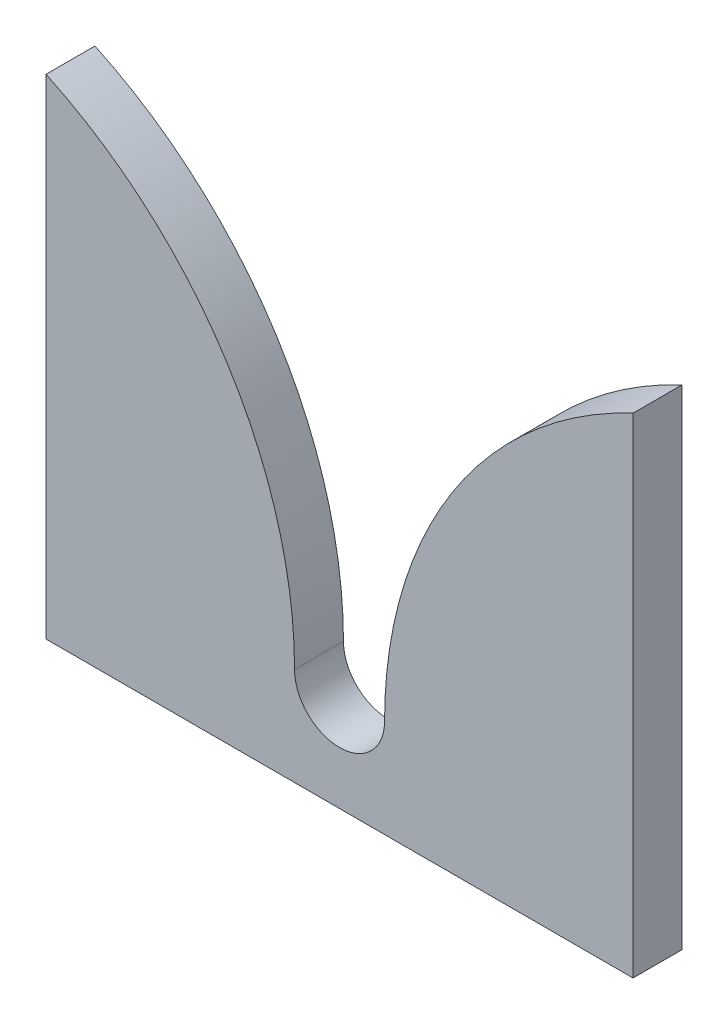
ISO-10303-21;
HEADER;
FILE_DESCRIPTION(('STEP AP214'),'2;1');
FILE_NAME('part.step','',(''),(''),'','','');
FILE_SCHEMA(('AUTOMOTIVE_DESIGN { 1 0 10303 214 1 1 1 1 }'));
ENDSEC;
DATA;
#1=APPLICATION_CONTEXT('core data for automotive mechanical design processes');
#2=APPLICATION_PROTOCOL_DEFINITION('international standard','automotive_design',2000,#1);
#3=PRODUCT_CONTEXT('',#1,'mechanical');
#4=PRODUCT('Part','Part','',(#3));
#5=PRODUCT_RELATED_PRODUCT_CATEGORY('part','',(#4));
#6=PRODUCT_DEFINITION_FORMATION('','',#4);
#7=PRODUCT_DEFINITION_CONTEXT('part definition',#1,'design');
#8=PRODUCT_DEFINITION('design','',#6,#7);
#9=PRODUCT_DEFINITION_SHAPE('','',#8);
#10=(LENGTH_UNIT() NAMED_UNIT(*) SI_UNIT(.MILLI.,.METRE.));
#11=(NAMED_UNIT(*) PLANE_ANGLE_UNIT() SI_UNIT($,.RADIAN.));
#12=(NAMED_UNIT(*) SI_UNIT($,.STERADIAN.) SOLID_ANGLE_UNIT());
#13=UNCERTAINTY_MEASURE_WITH_UNIT(LENGTH_MEASURE(1.E-05),#10,'distance_accuracy_value','');
#14=(GEOMETRIC_REPRESENTATION_CONTEXT(3) GLOBAL_UNCERTAINTY_ASSIGNED_CONTEXT((#13)) GLOBAL_UNIT_ASSIGNED_CONTEXT((#10,
#11,#12)) REPRESENTATION_CONTEXT('',''));
#15=CARTESIAN_POINT('',(0.,0.,0.));
#16=DIRECTION('',(0.,0.,1.));
#17=DIRECTION('',(1.,0.,0.));
#18=AXIS2_PLACEMENT_3D('',#15,#16,#17);
#19=CARTESIAN_POINT('',(100.071000000001,12.6999999999996,3.175));
#20=DIRECTION('',(0.,0.,-1.));
#21=DIRECTION('',(-1.,0.,0.));
#22=AXIS2_PLACEMENT_3D('',#19,#20,#21);
#23=CYLINDRICAL_SURFACE('',#22,56.1290000000007);
#24=CARTESIAN_POINT('',(100.071000000001,12.6999999999996,-3.175));
#25=DIRECTION('',(0.,0.,1.));
#26=DIRECTION('',(1.,0.,0.));
#27=AXIS2_PLACEMENT_3D('',#24,#25,#26);
#28=CIRCLE('',#27,56.1290000000007);
#29=CARTESIAN_POINT('',(43.942,12.7,-3.175));
#30=VERTEX_POINT('',#29);
#31=CARTESIAN_POINT('',(76.2,63.5,-3.175));
#32=VERTEX_POINT('',#31);
#33=EDGE_CURVE('E117',#30,#32,#28,.F.);
#34=ORIENTED_EDGE('',*,*,#33,.F.);
#35=DIRECTION('',(0.,0.,-1.));
#36=VECTOR('',#35,1.);
#37=CARTESIAN_POINT('',(43.942,12.7,3.175));
#38=LINE('',#37,#36);
#39=CARTESIAN_POINT('',(43.942,12.7,3.175));
#40=VERTEX_POINT('',#39);
#41=EDGE_CURVE('E11',#40,#30,#38,.T.);
#42=ORIENTED_EDGE('',*,*,#41,.F.);
#43=CARTESIAN_POINT('',(100.071000000001,12.6999999999996,3.175));
#44=DIRECTION('',(0.,0.,1.));
#45=DIRECTION('',(1.,0.,0.));
#46=AXIS2_PLACEMENT_3D('',#43,#44,#45);
#47=CIRCLE('',#46,56.1290000000007);
#48=CARTESIAN_POINT('',(76.2,63.5,3.175));
#49=VERTEX_POINT('',#48);
#50=EDGE_CURVE('E130',#40,#49,#47,.F.);
#51=ORIENTED_EDGE('',*,*,#50,.T.);
#52=DIRECTION('',(0.,0.,-1.));
#53=VECTOR('',#52,1.);
#54=CARTESIAN_POINT('',(76.2,63.5,3.175));
#55=LINE('',#54,#53);
#56=EDGE_CURVE('E79',#49,#32,#55,.T.);
#57=ORIENTED_EDGE('',*,*,#56,.T.);
#58=EDGE_LOOP('',(#34,#42,#51,#57));
#59=FACE_BOUND('',#58,.T.);
#60=ADVANCED_FACE('F35',(#59),#23,.T.);
#61=CARTESIAN_POINT('',(38.1,12.7,3.175));
#62=DIRECTION('',(0.,0.,-1.));
#63=DIRECTION('',(-1.,0.,0.));
#64=AXIS2_PLACEMENT_3D('',#61,#62,#63);
#65=CYLINDRICAL_SURFACE('',#64,5.842);
#66=CARTESIAN_POINT('',(38.1,12.7,-3.175));
#67=DIRECTION('',(0.,0.,1.));
#68=DIRECTION('',(1.,0.,0.));
#69=AXIS2_PLACEMENT_3D('',#66,#67,#68);
#70=CIRCLE('',#69,5.842);
#71=CARTESIAN_POINT('',(32.258,12.7,-3.175));
#72=VERTEX_POINT('',#71);
#73=EDGE_CURVE('E120',#72,#30,#70,.T.);
#74=ORIENTED_EDGE('',*,*,#73,.F.);
#75=DIRECTION('',(0.,0.,-1.));
#76=VECTOR('',#75,1.);
#77=CARTESIAN_POINT('',(32.258,12.7,3.175));
#78=LINE('',#77,#76);
#79=CARTESIAN_POINT('',(32.258,12.7,3.175));
#80=VERTEX_POINT('',#79);
#81=EDGE_CURVE('E43',#80,#72,#78,.T.);
#82=ORIENTED_EDGE('',*,*,#81,.F.);
#83=CARTESIAN_POINT('',(38.1,12.7,3.175));
#84=DIRECTION('',(0.,0.,1.));
#85=DIRECTION('',(1.,0.,0.));
#86=AXIS2_PLACEMENT_3D('',#83,#84,#85);
#87=CIRCLE('',#86,5.842);
#88=EDGE_CURVE('E112',#80,#40,#87,.T.);
#89=ORIENTED_EDGE('',*,*,#88,.T.);
#90=ORIENTED_EDGE('',*,*,#41,.T.);
#91=EDGE_LOOP('',(#74,#82,#89,#90));
#92=FACE_BOUND('',#91,.T.);
#93=ADVANCED_FACE('F141',(#92),#65,.F.);
#94=CARTESIAN_POINT('',(-23.871,12.7,3.175));
#95=DIRECTION('',(0.,0.,-1.));
#96=DIRECTION('',(-1.,0.,0.));
#97=AXIS2_PLACEMENT_3D('',#94,#95,#96);
#98=CYLINDRICAL_SURFACE('',#97,56.129);
#99=CARTESIAN_POINT('',(-23.871,12.7,-3.175));
#100=DIRECTION('',(0.,0.,1.));
#101=DIRECTION('',(1.,0.,0.));
#102=AXIS2_PLACEMENT_3D('',#99,#100,#101);
#103=CIRCLE('',#102,56.129);
#104=CARTESIAN_POINT('',(0.,63.5,-3.175));
#105=VERTEX_POINT('',#104);
#106=EDGE_CURVE('E123',#72,#105,#103,.T.);
#107=ORIENTED_EDGE('',*,*,#106,.T.);
#108=DIRECTION('',(0.,0.,-1.));
#109=VECTOR('',#108,1.);
#110=CARTESIAN_POINT('',(0.,63.5,3.175));
#111=LINE('',#110,#109);
#112=CARTESIAN_POINT('',(0.,63.5,3.175));
#113=VERTEX_POINT('',#112);
#114=EDGE_CURVE('E100',#113,#105,#111,.T.);
#115=ORIENTED_EDGE('',*,*,#114,.F.);
#116=CARTESIAN_POINT('',(-23.871,12.7,3.175));
#117=DIRECTION('',(0.,0.,1.));
#118=DIRECTION('',(1.,0.,0.));
#119=AXIS2_PLACEMENT_3D('',#116,#117,#118);
#120=CIRCLE('',#119,56.129);
#121=EDGE_CURVE('E109',#80,#113,#120,.T.);
#122=ORIENTED_EDGE('',*,*,#121,.F.);
#123=ORIENTED_EDGE('',*,*,#81,.T.);
#124=EDGE_LOOP('',(#107,#115,#122,#123));
#125=FACE_BOUND('',#124,.T.);
#126=ADVANCED_FACE('F135',(#125),#98,.T.);
#127=CARTESIAN_POINT('',(0.,0.,3.175));
#128=DIRECTION('',(-1.,0.,0.));
#129=DIRECTION('',(0.,-1.,0.));
#130=AXIS2_PLACEMENT_3D('',#127,#128,#129);
#131=PLANE('',#130);
#132=DIRECTION('',(0.,1.,0.));
#133=VECTOR('',#132,1.);
#134=CARTESIAN_POINT('',(0.,0.,-3.175));
#135=LINE('',#134,#133);
#136=CARTESIAN_POINT('',(0.,0.,-3.175));
#137=VERTEX_POINT('',#136);
#138=EDGE_CURVE('E99',#137,#105,#135,.T.);
#139=ORIENTED_EDGE('',*,*,#138,.F.);
#140=DIRECTION('',(0.,0.,-1.));
#141=VECTOR('',#140,1.);
#142=CARTESIAN_POINT('',(0.,0.,3.175));
#143=LINE('',#142,#141);
#144=CARTESIAN_POINT('',(0.,0.,3.175));
#145=VERTEX_POINT('',#144);
#146=EDGE_CURVE('E93',#145,#137,#143,.T.);
#147=ORIENTED_EDGE('',*,*,#146,.F.);
#148=DIRECTION('',(0.,1.,0.));
#149=VECTOR('',#148,1.);
#150=CARTESIAN_POINT('',(0.,0.,3.175));
#151=LINE('',#150,#149);
#152=EDGE_CURVE('E97',#145,#113,#151,.T.);
#153=ORIENTED_EDGE('',*,*,#152,.T.);
#154=ORIENTED_EDGE('',*,*,#114,.T.);
#155=EDGE_LOOP('',(#139,#147,#153,#154));
#156=FACE_BOUND('',#155,.T.);
#157=ADVANCED_FACE('F95',(#156),#131,.T.);
#158=CARTESIAN_POINT('',(0.,0.,3.175));
#159=DIRECTION('',(0.,1.,0.));
#160=DIRECTION('',(0.,0.,1.));
#161=AXIS2_PLACEMENT_3D('',#158,#159,#160);
#162=PLANE('',#161);
#163=DIRECTION('',(1.,0.,0.));
#164=VECTOR('',#163,1.);
#165=CARTESIAN_POINT('',(0.,0.,-3.175));
#166=LINE('',#165,#164);
#167=CARTESIAN_POINT('',(76.2,0.,-3.175));
#168=VERTEX_POINT('',#167);
#169=EDGE_CURVE('E72',#137,#168,#166,.T.);
#170=ORIENTED_EDGE('',*,*,#169,.T.);
#171=DIRECTION('',(0.,0.,-1.));
#172=VECTOR('',#171,1.);
#173=CARTESIAN_POINT('',(76.2,0.,3.175));
#174=LINE('',#173,#172);
#175=CARTESIAN_POINT('',(76.2,0.,3.175));
#176=VERTEX_POINT('',#175);
#177=EDGE_CURVE('E101',#176,#168,#174,.T.);
#178=ORIENTED_EDGE('',*,*,#177,.F.);
#179=DIRECTION('',(1.,0.,0.));
#180=VECTOR('',#179,1.);
#181=CARTESIAN_POINT('',(0.,0.,3.175));
#182=LINE('',#181,#180);
#183=EDGE_CURVE('E103',#145,#176,#182,.T.);
#184=ORIENTED_EDGE('',*,*,#183,.F.);
#185=ORIENTED_EDGE('',*,*,#146,.T.);
#186=EDGE_LOOP('',(#170,#178,#184,#185));
#187=FACE_BOUND('',#186,.T.);
#188=ADVANCED_FACE('F104',(#187),#162,.F.);
#189=CARTESIAN_POINT('',(76.2,0.,3.175));
#190=DIRECTION('',(-1.,0.,0.));
#191=DIRECTION('',(0.,0.,1.));
#192=AXIS2_PLACEMENT_3D('',#189,#190,#191);
#193=PLANE('',#192);
#194=DIRECTION('',(0.,1.,0.));
#195=VECTOR('',#194,1.);
#196=CARTESIAN_POINT('',(76.2,0.,-3.175));
#197=LINE('',#196,#195);
#198=EDGE_CURVE('E128',#168,#32,#197,.T.);
#199=ORIENTED_EDGE('',*,*,#198,.T.);
#200=ORIENTED_EDGE('',*,*,#56,.F.);
#201=DIRECTION('',(0.,1.,0.));
#202=VECTOR('',#201,1.);
#203=CARTESIAN_POINT('',(76.2,0.,3.175));
#204=LINE('',#203,#202);
#205=EDGE_CURVE('E51',#176,#49,#204,.T.);
#206=ORIENTED_EDGE('',*,*,#205,.F.);
#207=ORIENTED_EDGE('',*,*,#177,.T.);
#208=EDGE_LOOP('',(#199,#200,#206,#207));
#209=FACE_BOUND('',#208,.T.);
#210=ADVANCED_FACE('F144',(#209),#193,.F.);
#211=CARTESIAN_POINT('',(0.,0.,3.175));
#212=DIRECTION('',(0.,0.,1.));
#213=DIRECTION('',(1.,0.,0.));
#214=AXIS2_PLACEMENT_3D('',#211,#212,#213);
#215=PLANE('',#214);
#216=ORIENTED_EDGE('',*,*,#50,.F.);
#217=ORIENTED_EDGE('',*,*,#88,.F.);
#218=ORIENTED_EDGE('',*,*,#121,.T.);
#219=ORIENTED_EDGE('',*,*,#152,.F.);
#220=ORIENTED_EDGE('',*,*,#183,.T.);
#221=ORIENTED_EDGE('',*,*,#205,.T.);
#222=EDGE_LOOP('',(#216,#217,#218,#219,#220,#221));
#223=FACE_BOUND('',#222,.T.);
#224=ADVANCED_FACE('F106',(#223),#215,.T.);
#225=CARTESIAN_POINT('',(0.,0.,-3.175));
#226=DIRECTION('',(0.,0.,1.));
#227=DIRECTION('',(1.,0.,0.));
#228=AXIS2_PLACEMENT_3D('',#225,#226,#227);
#229=PLANE('',#228);
#230=ORIENTED_EDGE('',*,*,#33,.T.);
#231=ORIENTED_EDGE('',*,*,#198,.F.);
#232=ORIENTED_EDGE('',*,*,#169,.F.);
#233=ORIENTED_EDGE('',*,*,#138,.T.);
#234=ORIENTED_EDGE('',*,*,#106,.F.);
#235=ORIENTED_EDGE('',*,*,#73,.T.);
#236=EDGE_LOOP('',(#230,#231,#232,#233,#234,#235));
#237=FACE_BOUND('',#236,.T.);
#238=ADVANCED_FACE('F140',(#237),#229,.F.);
#239=CLOSED_SHELL('',(#60,#93,#126,#157,#188,#210,#224,#238));
#240=MANIFOLD_SOLID_BREP('B2',#239);
#241=ADVANCED_BREP_SHAPE_REPRESENTATION('',(#18,#240),#14);
#242=SHAPE_DEFINITION_REPRESENTATION(#9,#241);
ENDSEC;
END-ISO-10303-21;
